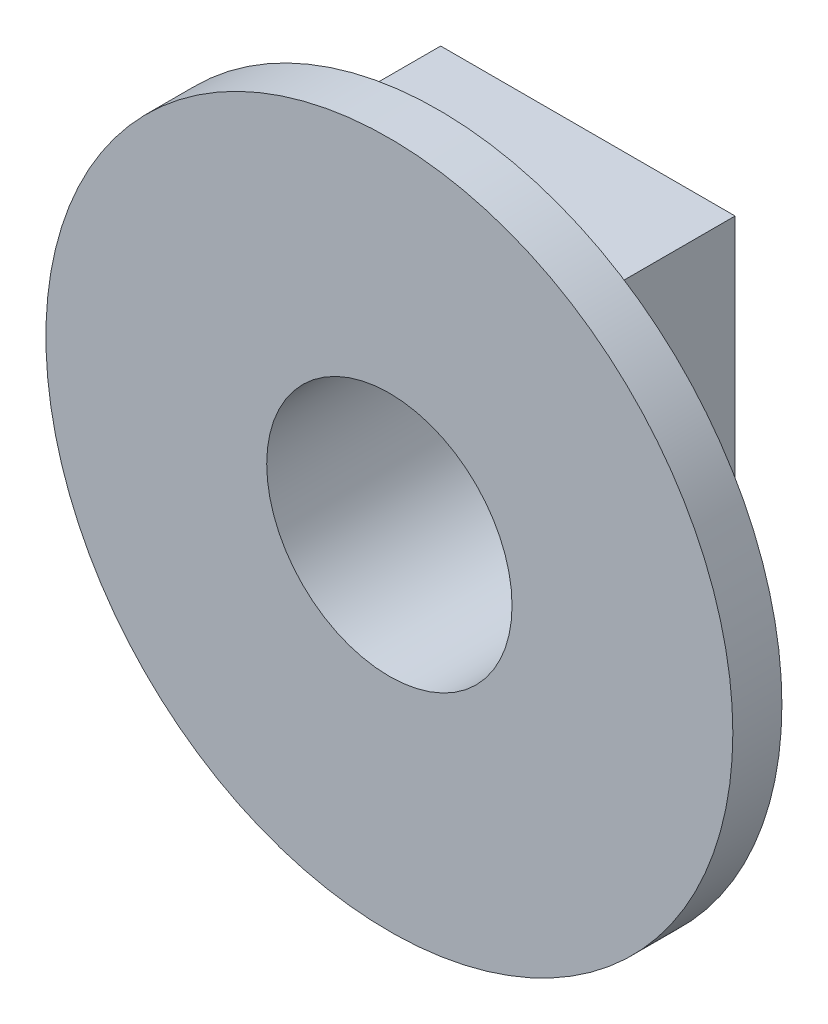
ISO-10303-21;
HEADER;
FILE_DESCRIPTION(('STEP AP214'),'2;1');
FILE_NAME('part.step','',(''),(''),'','','');
FILE_SCHEMA(('AUTOMOTIVE_DESIGN { 1 0 10303 214 1 1 1 1 }'));
ENDSEC;
DATA;
#1=APPLICATION_CONTEXT('core data for automotive mechanical design processes');
#2=APPLICATION_PROTOCOL_DEFINITION('international standard','automotive_design',2000,#1);
#3=PRODUCT_CONTEXT('',#1,'mechanical');
#4=PRODUCT('Part','Part','',(#3));
#5=PRODUCT_RELATED_PRODUCT_CATEGORY('part','',(#4));
#6=PRODUCT_DEFINITION_FORMATION('','',#4);
#7=PRODUCT_DEFINITION_CONTEXT('part definition',#1,'design');
#8=PRODUCT_DEFINITION('design','',#6,#7);
#9=PRODUCT_DEFINITION_SHAPE('','',#8);
#10=(LENGTH_UNIT() NAMED_UNIT(*) SI_UNIT(.MILLI.,.METRE.));
#11=(NAMED_UNIT(*) PLANE_ANGLE_UNIT() SI_UNIT($,.RADIAN.));
#12=(NAMED_UNIT(*) SI_UNIT($,.STERADIAN.) SOLID_ANGLE_UNIT());
#13=UNCERTAINTY_MEASURE_WITH_UNIT(LENGTH_MEASURE(1.E-05),#10,'distance_accuracy_value','');
#14=(GEOMETRIC_REPRESENTATION_CONTEXT(3) GLOBAL_UNCERTAINTY_ASSIGNED_CONTEXT((#13)) GLOBAL_UNIT_ASSIGNED_CONTEXT((#10,
#11,#12)) REPRESENTATION_CONTEXT('',''));
#15=CARTESIAN_POINT('',(0.,0.,0.));
#16=DIRECTION('',(0.,0.,1.));
#17=DIRECTION('',(1.,0.,0.));
#18=AXIS2_PLACEMENT_3D('',#15,#16,#17);
#19=CARTESIAN_POINT('',(-7.34580882076308,32.1020808428069,1.));
#20=DIRECTION('',(0.,0.,-1.));
#21=DIRECTION('',(-1.,0.,0.));
#22=AXIS2_PLACEMENT_3D('',#19,#20,#21);
#23=CYLINDRICAL_SURFACE('',#22,7.);
#24=CARTESIAN_POINT('',(-7.34580882076308,32.1020808428069,1.));
#25=DIRECTION('',(0.,0.,1.));
#26=DIRECTION('',(1.,0.,0.));
#27=AXIS2_PLACEMENT_3D('',#24,#25,#26);
#28=CIRCLE('',#27,7.);
#29=CARTESIAN_POINT('',(-0.345808820763086,32.1020808428069,1.));
#30=VERTEX_POINT('',#29);
#31=EDGE_CURVE('E11',#30,#30,#28,.T.);
#32=ORIENTED_EDGE('',*,*,#31,.F.);
#33=EDGE_LOOP('',(#32));
#34=FACE_BOUND('',#33,.T.);
#35=CARTESIAN_POINT('',(-7.34580882076308,32.1020808428069,0.));
#36=DIRECTION('',(0.,0.,1.));
#37=DIRECTION('',(1.,0.,0.));
#38=AXIS2_PLACEMENT_3D('',#35,#36,#37);
#39=CIRCLE('',#38,7.);
#40=CARTESIAN_POINT('',(-0.345808820763086,32.1020808428069,0.));
#41=VERTEX_POINT('',#40);
#42=EDGE_CURVE('E49',#41,#41,#39,.T.);
#43=ORIENTED_EDGE('',*,*,#42,.T.);
#44=EDGE_LOOP('',(#43));
#45=FACE_BOUND('',#44,.T.);
#46=ADVANCED_FACE('F41',(#34,#45),#23,.T.);
#47=CARTESIAN_POINT('',(-7.34580882076308,32.1020808428069,1.));
#48=DIRECTION('',(0.,0.,1.));
#49=DIRECTION('',(1.,0.,0.));
#50=AXIS2_PLACEMENT_3D('',#47,#48,#49);
#51=PLANE('',#50);
#52=CARTESIAN_POINT('',(-7.34580882076308,32.1020808428069,1.));
#53=DIRECTION('',(0.,0.,1.));
#54=DIRECTION('',(1.,0.,0.));
#55=AXIS2_PLACEMENT_3D('',#52,#53,#54);
#56=CIRCLE('',#55,2.5);
#57=CARTESIAN_POINT('',(-4.84580882076308,32.1020808428069,1.));
#58=VERTEX_POINT('',#57);
#59=EDGE_CURVE('E188',#58,#58,#56,.T.);
#60=ORIENTED_EDGE('',*,*,#59,.F.);
#61=EDGE_LOOP('',(#60));
#62=FACE_BOUND('',#61,.T.);
#63=ORIENTED_EDGE('',*,*,#31,.T.);
#64=EDGE_LOOP('',(#63));
#65=FACE_BOUND('',#64,.T.);
#66=ADVANCED_FACE('F122',(#62,#65),#51,.T.);
#67=CARTESIAN_POINT('',(-7.34580882076308,32.1020808428069,0.));
#68=DIRECTION('',(0.,0.,1.));
#69=DIRECTION('',(1.,0.,0.));
#70=AXIS2_PLACEMENT_3D('',#67,#68,#69);
#71=PLANE('',#70);
#72=DIRECTION('',(-1.,0.,0.));
#73=VECTOR('',#72,1.);
#74=CARTESIAN_POINT('',(-4.3,27.2506329674646,0.));
#75=LINE('',#74,#73);
#76=CARTESIAN_POINT('',(-4.3,27.2506329674646,0.));
#77=VERTEX_POINT('',#76);
#78=CARTESIAN_POINT('',(-10.3,27.2506329674646,0.));
#79=VERTEX_POINT('',#78);
#80=EDGE_CURVE('E57',#77,#79,#75,.T.);
#81=ORIENTED_EDGE('',*,*,#80,.F.);
#82=DIRECTION('',(0.,-1.,0.));
#83=VECTOR('',#82,1.);
#84=CARTESIAN_POINT('',(-4.3,27.2506329674646,0.));
#85=LINE('',#84,#83);
#86=CARTESIAN_POINT('',(-4.3,37.2506329674646,0.));
#87=VERTEX_POINT('',#86);
#88=EDGE_CURVE('E62',#87,#77,#85,.T.);
#89=ORIENTED_EDGE('',*,*,#88,.F.);
#90=DIRECTION('',(-1.,0.,0.));
#91=VECTOR('',#90,1.);
#92=CARTESIAN_POINT('',(-4.3,37.2506329674646,0.));
#93=LINE('',#92,#91);
#94=CARTESIAN_POINT('',(-10.3,37.2506329674646,0.));
#95=VERTEX_POINT('',#94);
#96=EDGE_CURVE('E102',#87,#95,#93,.T.);
#97=ORIENTED_EDGE('',*,*,#96,.T.);
#98=DIRECTION('',(0.,-1.,0.));
#99=VECTOR('',#98,1.);
#100=CARTESIAN_POINT('',(-10.3,27.2506329674646,0.));
#101=LINE('',#100,#99);
#102=EDGE_CURVE('E106',#95,#79,#101,.T.);
#103=ORIENTED_EDGE('',*,*,#102,.T.);
#104=EDGE_LOOP('',(#81,#89,#97,#103));
#105=FACE_BOUND('',#104,.T.);
#106=ORIENTED_EDGE('',*,*,#42,.F.);
#107=EDGE_LOOP('',(#106));
#108=FACE_BOUND('',#107,.T.);
#109=ADVANCED_FACE('F120',(#105,#108),#71,.F.);
#110=CARTESIAN_POINT('',(-4.3,27.2506329674646,-3.));
#111=DIRECTION('',(0.,1.,0.));
#112=DIRECTION('',(0.,0.,1.));
#113=AXIS2_PLACEMENT_3D('',#110,#111,#112);
#114=PLANE('',#113);
#115=DIRECTION('',(0.,0.,-1.));
#116=VECTOR('',#115,1.);
#117=CARTESIAN_POINT('',(-10.3,27.2506329674646,-3.));
#118=LINE('',#117,#116);
#119=CARTESIAN_POINT('',(-10.3,27.2506329674646,-3.));
#120=VERTEX_POINT('',#119);
#121=EDGE_CURVE('E92',#79,#120,#118,.T.);
#122=ORIENTED_EDGE('',*,*,#121,.T.);
#123=DIRECTION('',(-1.,0.,0.));
#124=VECTOR('',#123,1.);
#125=CARTESIAN_POINT('',(-4.3,27.2506329674646,-3.));
#126=LINE('',#125,#124);
#127=CARTESIAN_POINT('',(-4.3,27.2506329674646,-3.));
#128=VERTEX_POINT('',#127);
#129=EDGE_CURVE('E89',#128,#120,#126,.T.);
#130=ORIENTED_EDGE('',*,*,#129,.F.);
#131=DIRECTION('',(0.,0.,-1.));
#132=VECTOR('',#131,1.);
#133=CARTESIAN_POINT('',(-4.3,27.2506329674646,-3.));
#134=LINE('',#133,#132);
#135=EDGE_CURVE('E80',#77,#128,#134,.T.);
#136=ORIENTED_EDGE('',*,*,#135,.F.);
#137=ORIENTED_EDGE('',*,*,#80,.T.);
#138=EDGE_LOOP('',(#122,#130,#136,#137));
#139=FACE_BOUND('',#138,.T.);
#140=ADVANCED_FACE('F90',(#139),#114,.F.);
#141=CARTESIAN_POINT('',(-4.3,27.2506329674646,-3.));
#142=DIRECTION('',(0.,0.,1.));
#143=DIRECTION('',(0.,-1.,0.));
#144=AXIS2_PLACEMENT_3D('',#141,#142,#143);
#145=PLANE('',#144);
#146=CARTESIAN_POINT('',(-7.34580882076308,32.1020808428069,-3.));
#147=DIRECTION('',(0.,0.,1.));
#148=DIRECTION('',(0.,-1.,0.));
#149=AXIS2_PLACEMENT_3D('',#146,#147,#148);
#150=CIRCLE('',#149,2.5);
#151=CARTESIAN_POINT('',(-7.34580882076308,29.6020808428069,-3.));
#152=VERTEX_POINT('',#151);
#153=EDGE_CURVE('E44',#152,#152,#150,.T.);
#154=ORIENTED_EDGE('',*,*,#153,.T.);
#155=EDGE_LOOP('',(#154));
#156=FACE_BOUND('',#155,.T.);
#157=DIRECTION('',(0.,1.,0.));
#158=VECTOR('',#157,1.);
#159=CARTESIAN_POINT('',(-10.3,27.2506329674646,-3.));
#160=LINE('',#159,#158);
#161=CARTESIAN_POINT('',(-10.3,37.2506329674646,-3.));
#162=VERTEX_POINT('',#161);
#163=EDGE_CURVE('E109',#120,#162,#160,.T.);
#164=ORIENTED_EDGE('',*,*,#163,.T.);
#165=DIRECTION('',(-1.,0.,0.));
#166=VECTOR('',#165,1.);
#167=CARTESIAN_POINT('',(-4.3,37.2506329674646,-3.));
#168=LINE('',#167,#166);
#169=CARTESIAN_POINT('',(-4.3,37.2506329674646,-3.));
#170=VERTEX_POINT('',#169);
#171=EDGE_CURVE('E95',#170,#162,#168,.T.);
#172=ORIENTED_EDGE('',*,*,#171,.F.);
#173=DIRECTION('',(0.,1.,0.));
#174=VECTOR('',#173,1.);
#175=CARTESIAN_POINT('',(-4.3,27.2506329674646,-3.));
#176=LINE('',#175,#174);
#177=EDGE_CURVE('E84',#128,#170,#176,.T.);
#178=ORIENTED_EDGE('',*,*,#177,.F.);
#179=ORIENTED_EDGE('',*,*,#129,.T.);
#180=EDGE_LOOP('',(#164,#172,#178,#179));
#181=FACE_BOUND('',#180,.T.);
#182=ADVANCED_FACE('F97',(#156,#181),#145,.F.);
#183=CARTESIAN_POINT('',(-4.3,37.2506329674646,-3.));
#184=DIRECTION('',(0.,-1.,0.));
#185=DIRECTION('',(0.,0.,-1.));
#186=AXIS2_PLACEMENT_3D('',#183,#184,#185);
#187=PLANE('',#186);
#188=DIRECTION('',(0.,0.,1.));
#189=VECTOR('',#188,1.);
#190=CARTESIAN_POINT('',(-10.3,37.2506329674646,-3.));
#191=LINE('',#190,#189);
#192=EDGE_CURVE('E111',#162,#95,#191,.T.);
#193=ORIENTED_EDGE('',*,*,#192,.T.);
#194=ORIENTED_EDGE('',*,*,#96,.F.);
#195=DIRECTION('',(0.,0.,1.));
#196=VECTOR('',#195,1.);
#197=CARTESIAN_POINT('',(-4.3,37.2506329674646,-3.));
#198=LINE('',#197,#196);
#199=EDGE_CURVE('E100',#170,#87,#198,.T.);
#200=ORIENTED_EDGE('',*,*,#199,.F.);
#201=ORIENTED_EDGE('',*,*,#171,.T.);
#202=EDGE_LOOP('',(#193,#194,#200,#201));
#203=FACE_BOUND('',#202,.T.);
#204=ADVANCED_FACE('F155',(#203),#187,.F.);
#205=CARTESIAN_POINT('',(-4.3,0.,0.));
#206=DIRECTION('',(1.,0.,0.));
#207=DIRECTION('',(0.,0.,-1.));
#208=AXIS2_PLACEMENT_3D('',#205,#206,#207);
#209=PLANE('',#208);
#210=ORIENTED_EDGE('',*,*,#88,.T.);
#211=ORIENTED_EDGE('',*,*,#135,.T.);
#212=ORIENTED_EDGE('',*,*,#177,.T.);
#213=ORIENTED_EDGE('',*,*,#199,.T.);
#214=EDGE_LOOP('',(#210,#211,#212,#213));
#215=FACE_BOUND('',#214,.T.);
#216=ADVANCED_FACE('F82',(#215),#209,.T.);
#217=CARTESIAN_POINT('',(-10.3,0.,0.));
#218=DIRECTION('',(1.,0.,0.));
#219=DIRECTION('',(0.,0.,-1.));
#220=AXIS2_PLACEMENT_3D('',#217,#218,#219);
#221=PLANE('',#220);
#222=ORIENTED_EDGE('',*,*,#102,.F.);
#223=ORIENTED_EDGE('',*,*,#192,.F.);
#224=ORIENTED_EDGE('',*,*,#163,.F.);
#225=ORIENTED_EDGE('',*,*,#121,.F.);
#226=EDGE_LOOP('',(#222,#223,#224,#225));
#227=FACE_BOUND('',#226,.T.);
#228=ADVANCED_FACE('F170',(#227),#221,.F.);
#229=CARTESIAN_POINT('',(-7.34580882076308,32.1020808428069,-4.));
#230=DIRECTION('',(0.,0.,1.));
#231=DIRECTION('',(1.,0.,0.));
#232=AXIS2_PLACEMENT_3D('',#229,#230,#231);
#233=CYLINDRICAL_SURFACE('',#232,2.5);
#234=ORIENTED_EDGE('',*,*,#59,.T.);
#235=EDGE_LOOP('',(#234));
#236=FACE_BOUND('',#235,.T.);
#237=ORIENTED_EDGE('',*,*,#153,.F.);
#238=EDGE_LOOP('',(#237));
#239=FACE_BOUND('',#238,.T.);
#240=ADVANCED_FACE('F176',(#236,#239),#233,.F.);
#241=CLOSED_SHELL('',(#46,#66,#109,#140,#182,#204,#216,#228,#240));
#242=MANIFOLD_SOLID_BREP('B2',#241);
#243=ADVANCED_BREP_SHAPE_REPRESENTATION('',(#18,#242),#14);
#244=SHAPE_DEFINITION_REPRESENTATION(#9,#243);
ENDSEC;
END-ISO-10303-21;
